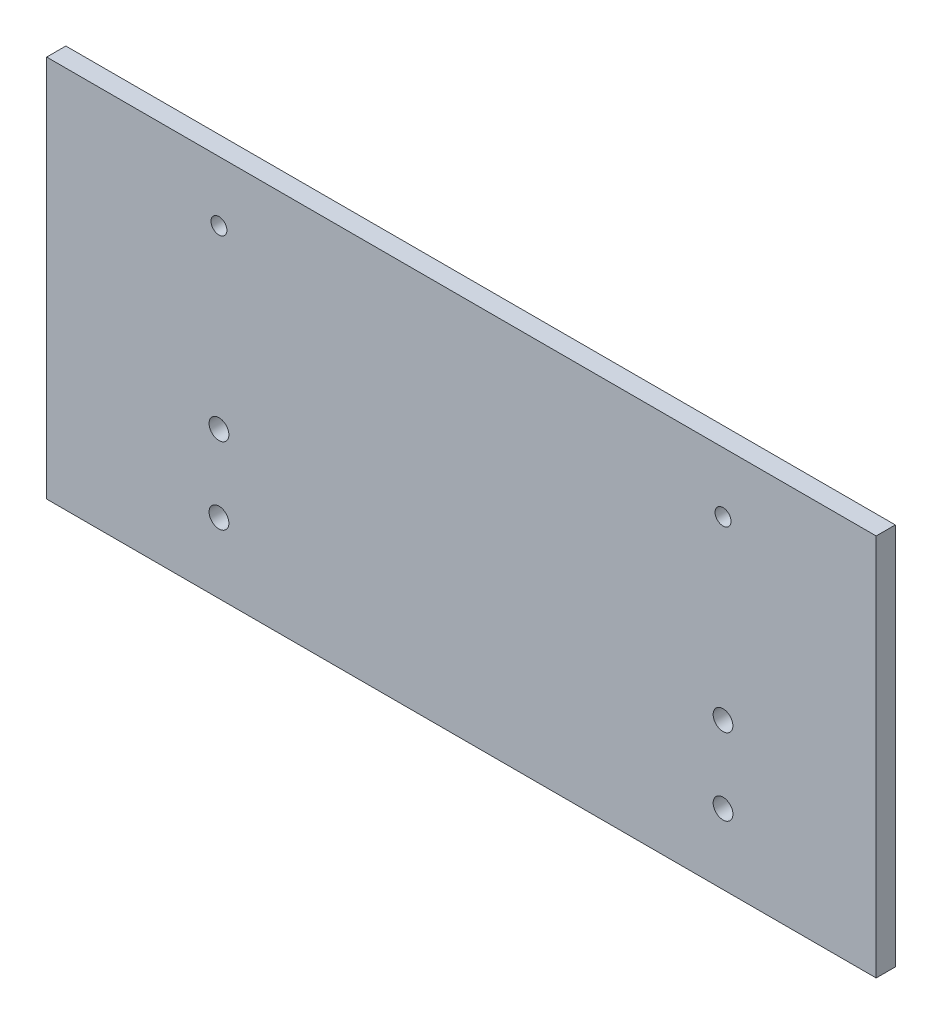
ISO-10303-21;
HEADER;
FILE_DESCRIPTION(('STEP AP214'),'2;1');
FILE_NAME('part.step','',(''),(''),'','','');
FILE_SCHEMA(('AUTOMOTIVE_DESIGN { 1 0 10303 214 1 1 1 1 }'));
ENDSEC;
DATA;
#1=APPLICATION_CONTEXT('core data for automotive mechanical design processes');
#2=APPLICATION_PROTOCOL_DEFINITION('international standard','automotive_design',2000,#1);
#3=PRODUCT_CONTEXT('',#1,'mechanical');
#4=PRODUCT('Part','Part','',(#3));
#5=PRODUCT_RELATED_PRODUCT_CATEGORY('part','',(#4));
#6=PRODUCT_DEFINITION_FORMATION('','',#4);
#7=PRODUCT_DEFINITION_CONTEXT('part definition',#1,'design');
#8=PRODUCT_DEFINITION('design','',#6,#7);
#9=PRODUCT_DEFINITION_SHAPE('','',#8);
#10=(LENGTH_UNIT() NAMED_UNIT(*) SI_UNIT(.MILLI.,.METRE.));
#11=(NAMED_UNIT(*) PLANE_ANGLE_UNIT() SI_UNIT($,.RADIAN.));
#12=(NAMED_UNIT(*) SI_UNIT($,.STERADIAN.) SOLID_ANGLE_UNIT());
#13=UNCERTAINTY_MEASURE_WITH_UNIT(LENGTH_MEASURE(1.E-05),#10,'distance_accuracy_value','');
#14=(GEOMETRIC_REPRESENTATION_CONTEXT(3) GLOBAL_UNCERTAINTY_ASSIGNED_CONTEXT((#13)) GLOBAL_UNIT_ASSIGNED_CONTEXT((#10,
#11,#12)) REPRESENTATION_CONTEXT('',''));
#15=CARTESIAN_POINT('',(0.,0.,0.));
#16=DIRECTION('',(0.,0.,1.));
#17=DIRECTION('',(1.,0.,0.));
#18=AXIS2_PLACEMENT_3D('',#15,#16,#17);
#19=CARTESIAN_POINT('',(0.,0.,3.));
#20=DIRECTION('',(0.,0.,1.));
#21=DIRECTION('',(1.,0.,0.));
#22=AXIS2_PLACEMENT_3D('',#19,#20,#21);
#23=PLANE('',#22);
#24=CARTESIAN_POINT('',(44.9055793991416,41.687982832618,3.));
#25=DIRECTION('',(0.,0.,1.));
#26=DIRECTION('',(1.,0.,0.));
#27=AXIS2_PLACEMENT_3D('',#24,#25,#26);
#28=CIRCLE('',#27,1.25);
#29=CARTESIAN_POINT('',(46.1555793991416,41.687982832618,3.));
#30=VERTEX_POINT('',#29);
#31=EDGE_CURVE('E158',#30,#30,#28,.T.);
#32=ORIENTED_EDGE('',*,*,#31,.F.);
#33=EDGE_LOOP('',(#32));
#34=FACE_BOUND('',#33,.T.);
#35=CARTESIAN_POINT('',(44.9055793991416,2.08798283261803,3.));
#36=DIRECTION('',(0.,0.,1.));
#37=DIRECTION('',(1.,0.,0.));
#38=AXIS2_PLACEMENT_3D('',#35,#36,#37);
#39=CIRCLE('',#38,1.55);
#40=CARTESIAN_POINT('',(46.4555793991416,2.08798283261803,3.));
#41=VERTEX_POINT('',#40);
#42=EDGE_CURVE('E142',#41,#41,#39,.T.);
#43=ORIENTED_EDGE('',*,*,#42,.F.);
#44=EDGE_LOOP('',(#43));
#45=FACE_BOUND('',#44,.T.);
#46=CARTESIAN_POINT('',(-34.0944206008584,14.087982832618,3.));
#47=DIRECTION('',(0.,0.,1.));
#48=DIRECTION('',(1.,0.,0.));
#49=AXIS2_PLACEMENT_3D('',#46,#47,#48);
#50=CIRCLE('',#49,1.55);
#51=CARTESIAN_POINT('',(-32.5444206008584,14.087982832618,3.));
#52=VERTEX_POINT('',#51);
#53=EDGE_CURVE('E112',#52,#52,#50,.T.);
#54=ORIENTED_EDGE('',*,*,#53,.F.);
#55=EDGE_LOOP('',(#54));
#56=FACE_BOUND('',#55,.T.);
#57=DIRECTION('',(0.,-1.,0.));
#58=VECTOR('',#57,1.);
#59=CARTESIAN_POINT('',(-61.0944206008584,51.087982832618,3.));
#60=LINE('',#59,#58);
#61=CARTESIAN_POINT('',(-61.0944206008584,51.087982832618,3.));
#62=VERTEX_POINT('',#61);
#63=CARTESIAN_POINT('',(-61.0944206008584,-8.91201716738197,3.));
#64=VERTEX_POINT('',#63);
#65=EDGE_CURVE('E92',#62,#64,#60,.T.);
#66=ORIENTED_EDGE('',*,*,#65,.T.);
#67=DIRECTION('',(1.,0.,0.));
#68=VECTOR('',#67,1.);
#69=CARTESIAN_POINT('',(-61.0944206008584,-8.91201716738197,3.));
#70=LINE('',#69,#68);
#71=CARTESIAN_POINT('',(68.9055793991416,-8.91201716738197,3.));
#72=VERTEX_POINT('',#71);
#73=EDGE_CURVE('E87',#64,#72,#70,.T.);
#74=ORIENTED_EDGE('',*,*,#73,.T.);
#75=DIRECTION('',(0.,1.,0.));
#76=VECTOR('',#75,1.);
#77=CARTESIAN_POINT('',(68.9055793991416,51.087982832618,3.));
#78=LINE('',#77,#76);
#79=CARTESIAN_POINT('',(68.9055793991416,51.087982832618,3.));
#80=VERTEX_POINT('',#79);
#81=EDGE_CURVE('E90',#72,#80,#78,.T.);
#82=ORIENTED_EDGE('',*,*,#81,.T.);
#83=DIRECTION('',(-1.,0.,0.));
#84=VECTOR('',#83,1.);
#85=CARTESIAN_POINT('',(-61.0944206008584,51.087982832618,3.));
#86=LINE('',#85,#84);
#87=EDGE_CURVE('E57',#80,#62,#86,.T.);
#88=ORIENTED_EDGE('',*,*,#87,.T.);
#89=EDGE_LOOP('',(#66,#74,#82,#88));
#90=FACE_BOUND('',#89,.T.);
#91=CARTESIAN_POINT('',(-34.0944206008584,2.08798283261803,3.));
#92=DIRECTION('',(0.,0.,1.));
#93=DIRECTION('',(1.,0.,0.));
#94=AXIS2_PLACEMENT_3D('',#91,#92,#93);
#95=CIRCLE('',#94,1.55);
#96=CARTESIAN_POINT('',(-32.5444206008584,2.08798283261803,3.));
#97=VERTEX_POINT('',#96);
#98=EDGE_CURVE('E134',#97,#97,#95,.T.);
#99=ORIENTED_EDGE('',*,*,#98,.F.);
#100=EDGE_LOOP('',(#99));
#101=FACE_BOUND('',#100,.T.);
#102=CARTESIAN_POINT('',(44.9055793991416,14.087982832618,3.));
#103=DIRECTION('',(0.,0.,1.));
#104=DIRECTION('',(1.,0.,0.));
#105=AXIS2_PLACEMENT_3D('',#102,#103,#104);
#106=CIRCLE('',#105,1.55);
#107=CARTESIAN_POINT('',(46.4555793991416,14.087982832618,3.));
#108=VERTEX_POINT('',#107);
#109=EDGE_CURVE('E150',#108,#108,#106,.T.);
#110=ORIENTED_EDGE('',*,*,#109,.F.);
#111=EDGE_LOOP('',(#110));
#112=FACE_BOUND('',#111,.T.);
#113=CARTESIAN_POINT('',(-34.0944206008584,41.687982832618,3.));
#114=DIRECTION('',(0.,0.,1.));
#115=DIRECTION('',(1.,0.,0.));
#116=AXIS2_PLACEMENT_3D('',#113,#114,#115);
#117=CIRCLE('',#116,1.25);
#118=CARTESIAN_POINT('',(-32.8444206008584,41.687982832618,3.));
#119=VERTEX_POINT('',#118);
#120=EDGE_CURVE('E166',#119,#119,#117,.T.);
#121=ORIENTED_EDGE('',*,*,#120,.F.);
#122=EDGE_LOOP('',(#121));
#123=FACE_BOUND('',#122,.T.);
#124=ADVANCED_FACE('F39',(#34,#45,#56,#90,#101,#112,#123),#23,.T.);
#125=CARTESIAN_POINT('',(0.,0.,0.));
#126=DIRECTION('',(0.,0.,1.));
#127=DIRECTION('',(1.,0.,0.));
#128=AXIS2_PLACEMENT_3D('',#125,#126,#127);
#129=PLANE('',#128);
#130=DIRECTION('',(0.,-1.,0.));
#131=VECTOR('',#130,1.);
#132=CARTESIAN_POINT('',(-61.0944206008584,51.087982832618,0.));
#133=LINE('',#132,#131);
#134=CARTESIAN_POINT('',(-61.0944206008584,51.087982832618,0.));
#135=VERTEX_POINT('',#134);
#136=CARTESIAN_POINT('',(-61.0944206008584,-8.91201716738197,0.));
#137=VERTEX_POINT('',#136);
#138=EDGE_CURVE('E108',#135,#137,#133,.T.);
#139=ORIENTED_EDGE('',*,*,#138,.F.);
#140=DIRECTION('',(-1.,0.,0.));
#141=VECTOR('',#140,1.);
#142=CARTESIAN_POINT('',(-61.0944206008584,51.087982832618,0.));
#143=LINE('',#142,#141);
#144=CARTESIAN_POINT('',(68.9055793991416,51.087982832618,0.));
#145=VERTEX_POINT('',#144);
#146=EDGE_CURVE('E80',#145,#135,#143,.T.);
#147=ORIENTED_EDGE('',*,*,#146,.F.);
#148=DIRECTION('',(0.,1.,0.));
#149=VECTOR('',#148,1.);
#150=CARTESIAN_POINT('',(68.9055793991416,51.087982832618,0.));
#151=LINE('',#150,#149);
#152=CARTESIAN_POINT('',(68.9055793991416,-8.91201716738197,0.));
#153=VERTEX_POINT('',#152);
#154=EDGE_CURVE('E74',#153,#145,#151,.T.);
#155=ORIENTED_EDGE('',*,*,#154,.F.);
#156=DIRECTION('',(1.,0.,0.));
#157=VECTOR('',#156,1.);
#158=CARTESIAN_POINT('',(-61.0944206008584,-8.91201716738197,0.));
#159=LINE('',#158,#157);
#160=EDGE_CURVE('E97',#137,#153,#159,.T.);
#161=ORIENTED_EDGE('',*,*,#160,.F.);
#162=EDGE_LOOP('',(#139,#147,#155,#161));
#163=FACE_BOUND('',#162,.T.);
#164=CARTESIAN_POINT('',(-34.0944206008584,14.087982832618,0.));
#165=DIRECTION('',(0.,0.,1.));
#166=DIRECTION('',(1.,0.,0.));
#167=AXIS2_PLACEMENT_3D('',#164,#165,#166);
#168=CIRCLE('',#167,1.55);
#169=CARTESIAN_POINT('',(-32.5444206008584,14.087982832618,0.));
#170=VERTEX_POINT('',#169);
#171=EDGE_CURVE('E130',#170,#170,#168,.T.);
#172=ORIENTED_EDGE('',*,*,#171,.T.);
#173=EDGE_LOOP('',(#172));
#174=FACE_BOUND('',#173,.T.);
#175=CARTESIAN_POINT('',(-34.0944206008584,2.08798283261803,0.));
#176=DIRECTION('',(0.,0.,1.));
#177=DIRECTION('',(1.,0.,0.));
#178=AXIS2_PLACEMENT_3D('',#175,#176,#177);
#179=CIRCLE('',#178,1.55);
#180=CARTESIAN_POINT('',(-32.5444206008584,2.08798283261803,0.));
#181=VERTEX_POINT('',#180);
#182=EDGE_CURVE('E138',#181,#181,#179,.T.);
#183=ORIENTED_EDGE('',*,*,#182,.T.);
#184=EDGE_LOOP('',(#183));
#185=FACE_BOUND('',#184,.T.);
#186=CARTESIAN_POINT('',(44.9055793991416,2.08798283261803,0.));
#187=DIRECTION('',(0.,0.,1.));
#188=DIRECTION('',(1.,0.,0.));
#189=AXIS2_PLACEMENT_3D('',#186,#187,#188);
#190=CIRCLE('',#189,1.55);
#191=CARTESIAN_POINT('',(46.4555793991416,2.08798283261803,0.));
#192=VERTEX_POINT('',#191);
#193=EDGE_CURVE('E146',#192,#192,#190,.T.);
#194=ORIENTED_EDGE('',*,*,#193,.T.);
#195=EDGE_LOOP('',(#194));
#196=FACE_BOUND('',#195,.T.);
#197=CARTESIAN_POINT('',(44.9055793991416,14.087982832618,0.));
#198=DIRECTION('',(0.,0.,1.));
#199=DIRECTION('',(1.,0.,0.));
#200=AXIS2_PLACEMENT_3D('',#197,#198,#199);
#201=CIRCLE('',#200,1.55);
#202=CARTESIAN_POINT('',(46.4555793991416,14.087982832618,0.));
#203=VERTEX_POINT('',#202);
#204=EDGE_CURVE('E154',#203,#203,#201,.T.);
#205=ORIENTED_EDGE('',*,*,#204,.T.);
#206=EDGE_LOOP('',(#205));
#207=FACE_BOUND('',#206,.T.);
#208=CARTESIAN_POINT('',(44.9055793991416,41.687982832618,0.));
#209=DIRECTION('',(0.,0.,1.));
#210=DIRECTION('',(1.,0.,0.));
#211=AXIS2_PLACEMENT_3D('',#208,#209,#210);
#212=CIRCLE('',#211,1.25);
#213=CARTESIAN_POINT('',(46.1555793991416,41.687982832618,0.));
#214=VERTEX_POINT('',#213);
#215=EDGE_CURVE('E162',#214,#214,#212,.T.);
#216=ORIENTED_EDGE('',*,*,#215,.T.);
#217=EDGE_LOOP('',(#216));
#218=FACE_BOUND('',#217,.T.);
#219=CARTESIAN_POINT('',(-34.0944206008584,41.687982832618,0.));
#220=DIRECTION('',(0.,0.,1.));
#221=DIRECTION('',(1.,0.,0.));
#222=AXIS2_PLACEMENT_3D('',#219,#220,#221);
#223=CIRCLE('',#222,1.25);
#224=CARTESIAN_POINT('',(-32.8444206008584,41.687982832618,0.));
#225=VERTEX_POINT('',#224);
#226=EDGE_CURVE('E170',#225,#225,#223,.T.);
#227=ORIENTED_EDGE('',*,*,#226,.T.);
#228=EDGE_LOOP('',(#227));
#229=FACE_BOUND('',#228,.T.);
#230=ADVANCED_FACE('F125',(#163,#174,#185,#196,#207,#218,#229),#129,.F.);
#231=CARTESIAN_POINT('',(-61.0944206008584,51.087982832618,3.));
#232=DIRECTION('',(1.,0.,0.));
#233=DIRECTION('',(0.,1.,0.));
#234=AXIS2_PLACEMENT_3D('',#231,#232,#233);
#235=PLANE('',#234);
#236=ORIENTED_EDGE('',*,*,#138,.T.);
#237=DIRECTION('',(0.,0.,-1.));
#238=VECTOR('',#237,1.);
#239=CARTESIAN_POINT('',(-61.0944206008584,-8.91201716738197,3.));
#240=LINE('',#239,#238);
#241=EDGE_CURVE('E11',#64,#137,#240,.T.);
#242=ORIENTED_EDGE('',*,*,#241,.F.);
#243=ORIENTED_EDGE('',*,*,#65,.F.);
#244=DIRECTION('',(0.,0.,-1.));
#245=VECTOR('',#244,1.);
#246=CARTESIAN_POINT('',(-61.0944206008584,51.087982832618,3.));
#247=LINE('',#246,#245);
#248=EDGE_CURVE('E104',#62,#135,#247,.T.);
#249=ORIENTED_EDGE('',*,*,#248,.T.);
#250=EDGE_LOOP('',(#236,#242,#243,#249));
#251=FACE_BOUND('',#250,.T.);
#252=ADVANCED_FACE('F41',(#251),#235,.F.);
#253=CARTESIAN_POINT('',(-61.0944206008584,-8.91201716738197,3.));
#254=DIRECTION('',(0.,1.,0.));
#255=DIRECTION('',(0.,0.,1.));
#256=AXIS2_PLACEMENT_3D('',#253,#254,#255);
#257=PLANE('',#256);
#258=ORIENTED_EDGE('',*,*,#160,.T.);
#259=DIRECTION('',(0.,0.,-1.));
#260=VECTOR('',#259,1.);
#261=CARTESIAN_POINT('',(68.9055793991416,-8.91201716738197,3.));
#262=LINE('',#261,#260);
#263=EDGE_CURVE('E49',#72,#153,#262,.T.);
#264=ORIENTED_EDGE('',*,*,#263,.F.);
#265=ORIENTED_EDGE('',*,*,#73,.F.);
#266=ORIENTED_EDGE('',*,*,#241,.T.);
#267=EDGE_LOOP('',(#258,#264,#265,#266));
#268=FACE_BOUND('',#267,.T.);
#269=ADVANCED_FACE('F96',(#268),#257,.F.);
#270=CARTESIAN_POINT('',(68.9055793991416,51.087982832618,3.));
#271=DIRECTION('',(-1.,0.,0.));
#272=DIRECTION('',(0.,0.,1.));
#273=AXIS2_PLACEMENT_3D('',#270,#271,#272);
#274=PLANE('',#273);
#275=ORIENTED_EDGE('',*,*,#154,.T.);
#276=DIRECTION('',(0.,0.,-1.));
#277=VECTOR('',#276,1.);
#278=CARTESIAN_POINT('',(68.9055793991416,51.087982832618,3.));
#279=LINE('',#278,#277);
#280=EDGE_CURVE('E99',#80,#145,#279,.T.);
#281=ORIENTED_EDGE('',*,*,#280,.F.);
#282=ORIENTED_EDGE('',*,*,#81,.F.);
#283=ORIENTED_EDGE('',*,*,#263,.T.);
#284=EDGE_LOOP('',(#275,#281,#282,#283));
#285=FACE_BOUND('',#284,.T.);
#286=ADVANCED_FACE('F100',(#285),#274,.F.);
#287=CARTESIAN_POINT('',(-61.0944206008584,51.087982832618,3.));
#288=DIRECTION('',(0.,-1.,0.));
#289=DIRECTION('',(0.,0.,-1.));
#290=AXIS2_PLACEMENT_3D('',#287,#288,#289);
#291=PLANE('',#290);
#292=ORIENTED_EDGE('',*,*,#146,.T.);
#293=ORIENTED_EDGE('',*,*,#248,.F.);
#294=ORIENTED_EDGE('',*,*,#87,.F.);
#295=ORIENTED_EDGE('',*,*,#280,.T.);
#296=EDGE_LOOP('',(#292,#293,#294,#295));
#297=FACE_BOUND('',#296,.T.);
#298=ADVANCED_FACE('F122',(#297),#291,.F.);
#299=CARTESIAN_POINT('',(-34.0944206008584,14.087982832618,3.));
#300=DIRECTION('',(0.,0.,-1.));
#301=DIRECTION('',(-1.,0.,0.));
#302=AXIS2_PLACEMENT_3D('',#299,#300,#301);
#303=CYLINDRICAL_SURFACE('',#302,1.55);
#304=ORIENTED_EDGE('',*,*,#53,.T.);
#305=EDGE_LOOP('',(#304));
#306=FACE_BOUND('',#305,.T.);
#307=ORIENTED_EDGE('',*,*,#171,.F.);
#308=EDGE_LOOP('',(#307));
#309=FACE_BOUND('',#308,.T.);
#310=ADVANCED_FACE('F191',(#306,#309),#303,.F.);
#311=CARTESIAN_POINT('',(-34.0944206008584,2.08798283261803,3.));
#312=DIRECTION('',(0.,0.,-1.));
#313=DIRECTION('',(-1.,0.,0.));
#314=AXIS2_PLACEMENT_3D('',#311,#312,#313);
#315=CYLINDRICAL_SURFACE('',#314,1.55);
#316=ORIENTED_EDGE('',*,*,#98,.T.);
#317=EDGE_LOOP('',(#316));
#318=FACE_BOUND('',#317,.T.);
#319=ORIENTED_EDGE('',*,*,#182,.F.);
#320=EDGE_LOOP('',(#319));
#321=FACE_BOUND('',#320,.T.);
#322=ADVANCED_FACE('F237',(#318,#321),#315,.F.);
#323=CARTESIAN_POINT('',(44.9055793991416,2.08798283261803,3.));
#324=DIRECTION('',(0.,0.,-1.));
#325=DIRECTION('',(-1.,0.,0.));
#326=AXIS2_PLACEMENT_3D('',#323,#324,#325);
#327=CYLINDRICAL_SURFACE('',#326,1.55);
#328=ORIENTED_EDGE('',*,*,#42,.T.);
#329=EDGE_LOOP('',(#328));
#330=FACE_BOUND('',#329,.T.);
#331=ORIENTED_EDGE('',*,*,#193,.F.);
#332=EDGE_LOOP('',(#331));
#333=FACE_BOUND('',#332,.T.);
#334=ADVANCED_FACE('F245',(#330,#333),#327,.F.);
#335=CARTESIAN_POINT('',(44.9055793991416,14.087982832618,3.));
#336=DIRECTION('',(0.,0.,-1.));
#337=DIRECTION('',(-1.,0.,0.));
#338=AXIS2_PLACEMENT_3D('',#335,#336,#337);
#339=CYLINDRICAL_SURFACE('',#338,1.55);
#340=ORIENTED_EDGE('',*,*,#109,.T.);
#341=EDGE_LOOP('',(#340));
#342=FACE_BOUND('',#341,.T.);
#343=ORIENTED_EDGE('',*,*,#204,.F.);
#344=EDGE_LOOP('',(#343));
#345=FACE_BOUND('',#344,.T.);
#346=ADVANCED_FACE('F253',(#342,#345),#339,.F.);
#347=CARTESIAN_POINT('',(44.9055793991416,41.687982832618,3.));
#348=DIRECTION('',(0.,0.,-1.));
#349=DIRECTION('',(-1.,0.,0.));
#350=AXIS2_PLACEMENT_3D('',#347,#348,#349);
#351=CYLINDRICAL_SURFACE('',#350,1.25);
#352=ORIENTED_EDGE('',*,*,#31,.T.);
#353=EDGE_LOOP('',(#352));
#354=FACE_BOUND('',#353,.T.);
#355=ORIENTED_EDGE('',*,*,#215,.F.);
#356=EDGE_LOOP('',(#355));
#357=FACE_BOUND('',#356,.T.);
#358=ADVANCED_FACE('F262',(#354,#357),#351,.F.);
#359=CARTESIAN_POINT('',(-34.0944206008584,41.687982832618,3.));
#360=DIRECTION('',(0.,0.,-1.));
#361=DIRECTION('',(-1.,0.,0.));
#362=AXIS2_PLACEMENT_3D('',#359,#360,#361);
#363=CYLINDRICAL_SURFACE('',#362,1.25);
#364=ORIENTED_EDGE('',*,*,#120,.T.);
#365=EDGE_LOOP('',(#364));
#366=FACE_BOUND('',#365,.T.);
#367=ORIENTED_EDGE('',*,*,#226,.F.);
#368=EDGE_LOOP('',(#367));
#369=FACE_BOUND('',#368,.T.);
#370=ADVANCED_FACE('F178',(#366,#369),#363,.F.);
#371=CLOSED_SHELL('',(#124,#230,#252,#269,#286,#298,#310,#322,#334,#346,#358,#370));
#372=MANIFOLD_SOLID_BREP('B2',#371);
#373=ADVANCED_BREP_SHAPE_REPRESENTATION('',(#18,#372),#14);
#374=SHAPE_DEFINITION_REPRESENTATION(#9,#373);
ENDSEC;
END-ISO-10303-21;
